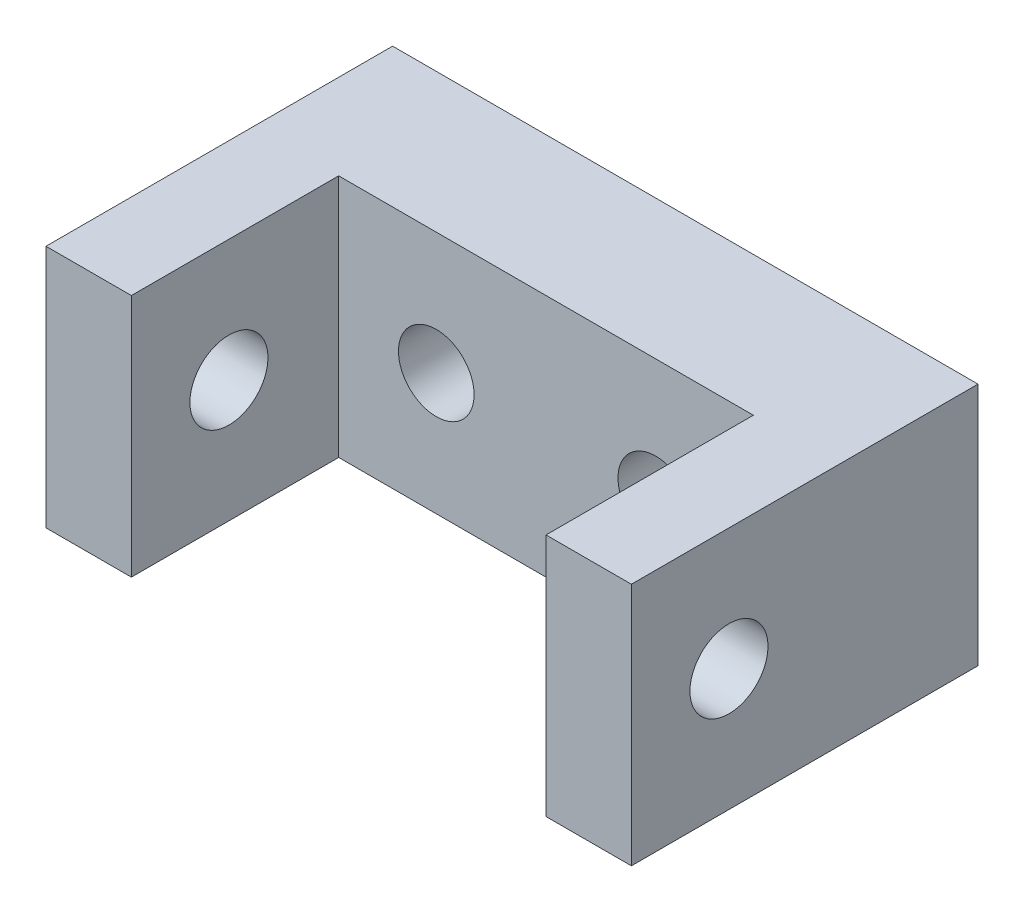
ISO-10303-21;
HEADER;
FILE_DESCRIPTION(('STEP AP214'),'2;1');
FILE_NAME('part.step','',(''),(''),'','','');
FILE_SCHEMA(('AUTOMOTIVE_DESIGN { 1 0 10303 214 1 1 1 1 }'));
ENDSEC;
DATA;
#1=APPLICATION_CONTEXT('core data for automotive mechanical design processes');
#2=APPLICATION_PROTOCOL_DEFINITION('international standard','automotive_design',2000,#1);
#3=PRODUCT_CONTEXT('',#1,'mechanical');
#4=PRODUCT('Part','Part','',(#3));
#5=PRODUCT_RELATED_PRODUCT_CATEGORY('part','',(#4));
#6=PRODUCT_DEFINITION_FORMATION('','',#4);
#7=PRODUCT_DEFINITION_CONTEXT('part definition',#1,'design');
#8=PRODUCT_DEFINITION('design','',#6,#7);
#9=PRODUCT_DEFINITION_SHAPE('','',#8);
#10=(LENGTH_UNIT() NAMED_UNIT(*) SI_UNIT(.MILLI.,.METRE.));
#11=(NAMED_UNIT(*) PLANE_ANGLE_UNIT() SI_UNIT($,.RADIAN.));
#12=(NAMED_UNIT(*) SI_UNIT($,.STERADIAN.) SOLID_ANGLE_UNIT());
#13=UNCERTAINTY_MEASURE_WITH_UNIT(LENGTH_MEASURE(1.E-05),#10,'distance_accuracy_value','');
#14=(GEOMETRIC_REPRESENTATION_CONTEXT(3) GLOBAL_UNCERTAINTY_ASSIGNED_CONTEXT((#13)) GLOBAL_UNIT_ASSIGNED_CONTEXT((#10,
#11,#12)) REPRESENTATION_CONTEXT('',''));
#15=CARTESIAN_POINT('',(0.,0.,0.));
#16=DIRECTION('',(0.,0.,1.));
#17=DIRECTION('',(1.,0.,0.));
#18=AXIS2_PLACEMENT_3D('',#15,#16,#17);
#19=CARTESIAN_POINT('',(0.,0.,14.21));
#20=DIRECTION('',(0.,0.,-1.));
#21=DIRECTION('',(-1.,0.,0.));
#22=AXIS2_PLACEMENT_3D('',#19,#20,#21);
#23=PLANE('',#22);
#24=DIRECTION('',(0.,1.,0.));
#25=VECTOR('',#24,1.);
#26=CARTESIAN_POINT('',(8.5,0.,14.21));
#27=LINE('',#26,#25);
#28=CARTESIAN_POINT('',(8.5,-5.,14.21));
#29=VERTEX_POINT('',#28);
#30=CARTESIAN_POINT('',(8.5,5.,14.21));
#31=VERTEX_POINT('',#30);
#32=EDGE_CURVE('E43',#29,#31,#27,.T.);
#33=ORIENTED_EDGE('',*,*,#32,.F.);
#34=DIRECTION('',(1.,0.,0.));
#35=VECTOR('',#34,1.);
#36=CARTESIAN_POINT('',(-12.,-5.,14.21));
#37=LINE('',#36,#35);
#38=CARTESIAN_POINT('',(12.,-5.,14.21));
#39=VERTEX_POINT('',#38);
#40=EDGE_CURVE('E58',#29,#39,#37,.T.);
#41=ORIENTED_EDGE('',*,*,#40,.T.);
#42=DIRECTION('',(0.,1.,0.));
#43=VECTOR('',#42,1.);
#44=CARTESIAN_POINT('',(12.,-5.,14.21));
#45=LINE('',#44,#43);
#46=CARTESIAN_POINT('',(12.,5.,14.21));
#47=VERTEX_POINT('',#46);
#48=EDGE_CURVE('E142',#39,#47,#45,.T.);
#49=ORIENTED_EDGE('',*,*,#48,.T.);
#50=DIRECTION('',(-1.,0.,0.));
#51=VECTOR('',#50,1.);
#52=CARTESIAN_POINT('',(-12.,5.,14.21));
#53=LINE('',#52,#51);
#54=EDGE_CURVE('E88',#47,#31,#53,.T.);
#55=ORIENTED_EDGE('',*,*,#54,.T.);
#56=EDGE_LOOP('',(#33,#41,#49,#55));
#57=FACE_BOUND('',#56,.T.);
#58=ADVANCED_FACE('F34',(#57),#23,.F.);
#59=CARTESIAN_POINT('',(12.,-5.,14.21));
#60=DIRECTION('',(-1.,0.,0.));
#61=DIRECTION('',(0.,0.,1.));
#62=AXIS2_PLACEMENT_3D('',#59,#60,#61);
#63=PLANE('',#62);
#64=CARTESIAN_POINT('',(12.,0.,10.21));
#65=DIRECTION('',(-1.,0.,0.));
#66=DIRECTION('',(0.,0.,1.));
#67=AXIS2_PLACEMENT_3D('',#64,#65,#66);
#68=CIRCLE('',#67,1.6);
#69=CARTESIAN_POINT('',(12.,0.,11.81));
#70=VERTEX_POINT('',#69);
#71=EDGE_CURVE('E238',#70,#70,#68,.T.);
#72=ORIENTED_EDGE('',*,*,#71,.T.);
#73=EDGE_LOOP('',(#72));
#74=FACE_BOUND('',#73,.T.);
#75=DIRECTION('',(0.,1.,0.));
#76=VECTOR('',#75,1.);
#77=CARTESIAN_POINT('',(12.,-5.,0.));
#78=LINE('',#77,#76);
#79=CARTESIAN_POINT('',(12.,-5.,0.));
#80=VERTEX_POINT('',#79);
#81=CARTESIAN_POINT('',(12.,5.,0.));
#82=VERTEX_POINT('',#81);
#83=EDGE_CURVE('E141',#80,#82,#78,.T.);
#84=ORIENTED_EDGE('',*,*,#83,.T.);
#85=DIRECTION('',(0.,0.,-1.));
#86=VECTOR('',#85,1.);
#87=CARTESIAN_POINT('',(12.,5.,14.21));
#88=LINE('',#87,#86);
#89=EDGE_CURVE('E164',#47,#82,#88,.T.);
#90=ORIENTED_EDGE('',*,*,#89,.F.);
#91=ORIENTED_EDGE('',*,*,#48,.F.);
#92=DIRECTION('',(0.,0.,-1.));
#93=VECTOR('',#92,1.);
#94=CARTESIAN_POINT('',(12.,-5.,14.21));
#95=LINE('',#94,#93);
#96=EDGE_CURVE('E150',#39,#80,#95,.T.);
#97=ORIENTED_EDGE('',*,*,#96,.T.);
#98=EDGE_LOOP('',(#84,#90,#91,#97));
#99=FACE_BOUND('',#98,.T.);
#100=ADVANCED_FACE('F36',(#74,#99),#63,.F.);
#101=CARTESIAN_POINT('',(-12.,5.,14.21));
#102=DIRECTION('',(0.,-1.,0.));
#103=DIRECTION('',(0.,0.,-1.));
#104=AXIS2_PLACEMENT_3D('',#101,#102,#103);
#105=PLANE('',#104);
#106=CARTESIAN_POINT('',(-8.5,5.,14.21));
#107=VERTEX_POINT('',#106);
#108=CARTESIAN_POINT('',(-12.,5.,14.21));
#109=VERTEX_POINT('',#108);
#110=EDGE_CURVE('E144',#107,#109,#53,.T.);
#111=ORIENTED_EDGE('',*,*,#110,.F.);
#112=DIRECTION('',(0.,0.,-1.));
#113=VECTOR('',#112,1.);
#114=CARTESIAN_POINT('',(-8.5,5.,14.21));
#115=LINE('',#114,#113);
#116=CARTESIAN_POINT('',(-8.5,5.,5.71));
#117=VERTEX_POINT('',#116);
#118=EDGE_CURVE('E138',#107,#117,#115,.T.);
#119=ORIENTED_EDGE('',*,*,#118,.T.);
#120=DIRECTION('',(1.,0.,0.));
#121=VECTOR('',#120,1.);
#122=CARTESIAN_POINT('',(-12.,5.,5.71));
#123=LINE('',#122,#121);
#124=CARTESIAN_POINT('',(8.5,5.,5.71));
#125=VERTEX_POINT('',#124);
#126=EDGE_CURVE('E118',#117,#125,#123,.T.);
#127=ORIENTED_EDGE('',*,*,#126,.T.);
#128=DIRECTION('',(0.,0.,-1.));
#129=VECTOR('',#128,1.);
#130=CARTESIAN_POINT('',(8.49999999999999,5.,14.21));
#131=LINE('',#130,#129);
#132=EDGE_CURVE('E135',#31,#125,#131,.T.);
#133=ORIENTED_EDGE('',*,*,#132,.F.);
#134=ORIENTED_EDGE('',*,*,#54,.F.);
#135=ORIENTED_EDGE('',*,*,#89,.T.);
#136=DIRECTION('',(-1.,0.,0.));
#137=VECTOR('',#136,1.);
#138=CARTESIAN_POINT('',(-12.,5.,0.));
#139=LINE('',#138,#137);
#140=CARTESIAN_POINT('',(-12.,5.,0.));
#141=VERTEX_POINT('',#140);
#142=EDGE_CURVE('E153',#82,#141,#139,.T.);
#143=ORIENTED_EDGE('',*,*,#142,.T.);
#144=DIRECTION('',(0.,0.,-1.));
#145=VECTOR('',#144,1.);
#146=CARTESIAN_POINT('',(-12.,5.,14.21));
#147=LINE('',#146,#145);
#148=EDGE_CURVE('E161',#109,#141,#147,.T.);
#149=ORIENTED_EDGE('',*,*,#148,.F.);
#150=EDGE_LOOP('',(#111,#119,#127,#133,#134,#135,#143,#149));
#151=FACE_BOUND('',#150,.T.);
#152=ADVANCED_FACE('F168',(#151),#105,.F.);
#153=CARTESIAN_POINT('',(-12.,-5.,14.21));
#154=DIRECTION('',(1.,0.,0.));
#155=DIRECTION('',(0.,0.,-1.));
#156=AXIS2_PLACEMENT_3D('',#153,#154,#155);
#157=PLANE('',#156);
#158=CARTESIAN_POINT('',(-12.,0.,10.21));
#159=DIRECTION('',(-1.,0.,0.));
#160=DIRECTION('',(0.,0.,1.));
#161=AXIS2_PLACEMENT_3D('',#158,#159,#160);
#162=CIRCLE('',#161,1.6);
#163=CARTESIAN_POINT('',(-12.,0.,11.81));
#164=VERTEX_POINT('',#163);
#165=EDGE_CURVE('E237',#164,#164,#162,.T.);
#166=ORIENTED_EDGE('',*,*,#165,.F.);
#167=EDGE_LOOP('',(#166));
#168=FACE_BOUND('',#167,.T.);
#169=DIRECTION('',(0.,-1.,0.));
#170=VECTOR('',#169,1.);
#171=CARTESIAN_POINT('',(-12.,-5.,0.));
#172=LINE('',#171,#170);
#173=CARTESIAN_POINT('',(-12.,-5.,0.));
#174=VERTEX_POINT('',#173);
#175=EDGE_CURVE('E155',#141,#174,#172,.T.);
#176=ORIENTED_EDGE('',*,*,#175,.T.);
#177=DIRECTION('',(0.,0.,-1.));
#178=VECTOR('',#177,1.);
#179=CARTESIAN_POINT('',(-12.,-5.,14.21));
#180=LINE('',#179,#178);
#181=CARTESIAN_POINT('',(-12.,-5.,14.21));
#182=VERTEX_POINT('',#181);
#183=EDGE_CURVE('E159',#182,#174,#180,.T.);
#184=ORIENTED_EDGE('',*,*,#183,.F.);
#185=DIRECTION('',(0.,-1.,0.));
#186=VECTOR('',#185,1.);
#187=CARTESIAN_POINT('',(-12.,-5.,14.21));
#188=LINE('',#187,#186);
#189=EDGE_CURVE('E146',#109,#182,#188,.T.);
#190=ORIENTED_EDGE('',*,*,#189,.F.);
#191=ORIENTED_EDGE('',*,*,#148,.T.);
#192=EDGE_LOOP('',(#176,#184,#190,#191));
#193=FACE_BOUND('',#192,.T.);
#194=ADVANCED_FACE('F178',(#168,#193),#157,.F.);
#195=CARTESIAN_POINT('',(-12.,-5.,14.21));
#196=DIRECTION('',(0.,1.,0.));
#197=DIRECTION('',(0.,0.,1.));
#198=AXIS2_PLACEMENT_3D('',#195,#196,#197);
#199=PLANE('',#198);
#200=DIRECTION('',(1.,0.,0.));
#201=VECTOR('',#200,1.);
#202=CARTESIAN_POINT('',(0.,-5.,5.71));
#203=LINE('',#202,#201);
#204=CARTESIAN_POINT('',(-8.5,-5.,5.71));
#205=VERTEX_POINT('',#204);
#206=CARTESIAN_POINT('',(8.5,-5.,5.71));
#207=VERTEX_POINT('',#206);
#208=EDGE_CURVE('E116',#205,#207,#203,.T.);
#209=ORIENTED_EDGE('',*,*,#208,.F.);
#210=DIRECTION('',(0.,0.,-1.));
#211=VECTOR('',#210,1.);
#212=CARTESIAN_POINT('',(-8.5,-5.,0.));
#213=LINE('',#212,#211);
#214=CARTESIAN_POINT('',(-8.5,-5.,14.21));
#215=VERTEX_POINT('',#214);
#216=EDGE_CURVE('E124',#215,#205,#213,.T.);
#217=ORIENTED_EDGE('',*,*,#216,.F.);
#218=EDGE_CURVE('E148',#182,#215,#37,.T.);
#219=ORIENTED_EDGE('',*,*,#218,.F.);
#220=ORIENTED_EDGE('',*,*,#183,.T.);
#221=DIRECTION('',(1.,0.,0.));
#222=VECTOR('',#221,1.);
#223=CARTESIAN_POINT('',(-12.,-5.,0.));
#224=LINE('',#223,#222);
#225=EDGE_CURVE('E80',#174,#80,#224,.T.);
#226=ORIENTED_EDGE('',*,*,#225,.T.);
#227=ORIENTED_EDGE('',*,*,#96,.F.);
#228=ORIENTED_EDGE('',*,*,#40,.F.);
#229=DIRECTION('',(0.,0.,-1.));
#230=VECTOR('',#229,1.);
#231=CARTESIAN_POINT('',(8.5,-5.,0.));
#232=LINE('',#231,#230);
#233=EDGE_CURVE('E50',#29,#207,#232,.T.);
#234=ORIENTED_EDGE('',*,*,#233,.T.);
#235=EDGE_LOOP('',(#209,#217,#219,#220,#226,#227,#228,#234));
#236=FACE_BOUND('',#235,.T.);
#237=ADVANCED_FACE('F130',(#236),#199,.F.);
#238=ORIENTED_EDGE('',*,*,#218,.T.);
#239=DIRECTION('',(0.,1.,0.));
#240=VECTOR('',#239,1.);
#241=CARTESIAN_POINT('',(-8.5,0.,14.21));
#242=LINE('',#241,#240);
#243=EDGE_CURVE('E11',#215,#107,#242,.T.);
#244=ORIENTED_EDGE('',*,*,#243,.T.);
#245=ORIENTED_EDGE('',*,*,#110,.T.);
#246=ORIENTED_EDGE('',*,*,#189,.T.);
#247=EDGE_LOOP('',(#238,#244,#245,#246));
#248=FACE_BOUND('',#247,.T.);
#249=ADVANCED_FACE('F182',(#248),#23,.F.);
#250=CARTESIAN_POINT('',(0.,0.,0.));
#251=DIRECTION('',(0.,0.,-1.));
#252=DIRECTION('',(-1.,0.,0.));
#253=AXIS2_PLACEMENT_3D('',#250,#251,#252);
#254=PLANE('',#253);
#255=CARTESIAN_POINT('',(-4.5,0.,0.));
#256=DIRECTION('',(0.,0.,-1.));
#257=DIRECTION('',(-1.,0.,0.));
#258=AXIS2_PLACEMENT_3D('',#255,#256,#257);
#259=CIRCLE('',#258,1.55);
#260=CARTESIAN_POINT('',(-6.05,0.,0.));
#261=VERTEX_POINT('',#260);
#262=EDGE_CURVE('E224',#261,#261,#259,.T.);
#263=ORIENTED_EDGE('',*,*,#262,.F.);
#264=EDGE_LOOP('',(#263));
#265=FACE_BOUND('',#264,.T.);
#266=CARTESIAN_POINT('',(4.5,0.,0.));
#267=DIRECTION('',(0.,0.,-1.));
#268=DIRECTION('',(-1.,0.,0.));
#269=AXIS2_PLACEMENT_3D('',#266,#267,#268);
#270=CIRCLE('',#269,1.55);
#271=CARTESIAN_POINT('',(2.95,0.,0.));
#272=VERTEX_POINT('',#271);
#273=EDGE_CURVE('E228',#272,#272,#270,.T.);
#274=ORIENTED_EDGE('',*,*,#273,.F.);
#275=EDGE_LOOP('',(#274));
#276=FACE_BOUND('',#275,.T.);
#277=ORIENTED_EDGE('',*,*,#83,.F.);
#278=ORIENTED_EDGE('',*,*,#225,.F.);
#279=ORIENTED_EDGE('',*,*,#175,.F.);
#280=ORIENTED_EDGE('',*,*,#142,.F.);
#281=EDGE_LOOP('',(#277,#278,#279,#280));
#282=FACE_BOUND('',#281,.T.);
#283=ADVANCED_FACE('F180',(#265,#276,#282),#254,.T.);
#284=CARTESIAN_POINT('',(0.,7.,5.71));
#285=DIRECTION('',(0.,0.,-1.));
#286=DIRECTION('',(-1.,0.,0.));
#287=AXIS2_PLACEMENT_3D('',#284,#285,#286);
#288=PLANE('',#287);
#289=CARTESIAN_POINT('',(-4.5,0.,5.71));
#290=DIRECTION('',(0.,0.,1.));
#291=DIRECTION('',(1.,0.,0.));
#292=AXIS2_PLACEMENT_3D('',#289,#290,#291);
#293=CIRCLE('',#292,1.55);
#294=CARTESIAN_POINT('',(-2.95,0.,5.71));
#295=VERTEX_POINT('',#294);
#296=EDGE_CURVE('E227',#295,#295,#293,.T.);
#297=ORIENTED_EDGE('',*,*,#296,.F.);
#298=EDGE_LOOP('',(#297));
#299=FACE_BOUND('',#298,.T.);
#300=CARTESIAN_POINT('',(4.5,0.,5.71));
#301=DIRECTION('',(0.,0.,1.));
#302=DIRECTION('',(1.,0.,0.));
#303=AXIS2_PLACEMENT_3D('',#300,#301,#302);
#304=CIRCLE('',#303,1.55);
#305=CARTESIAN_POINT('',(6.05,0.,5.71));
#306=VERTEX_POINT('',#305);
#307=EDGE_CURVE('E229',#306,#306,#304,.T.);
#308=ORIENTED_EDGE('',*,*,#307,.F.);
#309=EDGE_LOOP('',(#308));
#310=FACE_BOUND('',#309,.T.);
#311=DIRECTION('',(0.,-1.,0.));
#312=VECTOR('',#311,1.);
#313=CARTESIAN_POINT('',(-8.5,7.,5.71));
#314=LINE('',#313,#312);
#315=EDGE_CURVE('E111',#117,#205,#314,.T.);
#316=ORIENTED_EDGE('',*,*,#315,.T.);
#317=ORIENTED_EDGE('',*,*,#208,.T.);
#318=DIRECTION('',(0.,-1.,0.));
#319=VECTOR('',#318,1.);
#320=CARTESIAN_POINT('',(8.5,7.,5.71));
#321=LINE('',#320,#319);
#322=EDGE_CURVE('E121',#125,#207,#321,.T.);
#323=ORIENTED_EDGE('',*,*,#322,.F.);
#324=ORIENTED_EDGE('',*,*,#126,.F.);
#325=EDGE_LOOP('',(#316,#317,#323,#324));
#326=FACE_BOUND('',#325,.T.);
#327=ADVANCED_FACE('F113',(#299,#310,#326),#288,.F.);
#328=CARTESIAN_POINT('',(-8.5,7.,0.));
#329=DIRECTION('',(-1.,0.,0.));
#330=DIRECTION('',(0.,0.,1.));
#331=AXIS2_PLACEMENT_3D('',#328,#329,#330);
#332=PLANE('',#331);
#333=CARTESIAN_POINT('',(-8.5,0.,10.21));
#334=DIRECTION('',(-1.,0.,0.));
#335=DIRECTION('',(0.,0.,1.));
#336=AXIS2_PLACEMENT_3D('',#333,#334,#335);
#337=CIRCLE('',#336,1.6);
#338=CARTESIAN_POINT('',(-8.5,0.,11.81));
#339=VERTEX_POINT('',#338);
#340=EDGE_CURVE('E128',#339,#339,#337,.T.);
#341=ORIENTED_EDGE('',*,*,#340,.T.);
#342=EDGE_LOOP('',(#341));
#343=FACE_BOUND('',#342,.T.);
#344=ORIENTED_EDGE('',*,*,#243,.F.);
#345=ORIENTED_EDGE('',*,*,#216,.T.);
#346=ORIENTED_EDGE('',*,*,#315,.F.);
#347=ORIENTED_EDGE('',*,*,#118,.F.);
#348=EDGE_LOOP('',(#344,#345,#346,#347));
#349=FACE_BOUND('',#348,.T.);
#350=ADVANCED_FACE('F125',(#343,#349),#332,.F.);
#351=CARTESIAN_POINT('',(8.5,7.,0.));
#352=DIRECTION('',(-1.,0.,0.));
#353=DIRECTION('',(0.,0.,1.));
#354=AXIS2_PLACEMENT_3D('',#351,#352,#353);
#355=PLANE('',#354);
#356=CARTESIAN_POINT('',(8.5,0.,10.21));
#357=DIRECTION('',(-1.,0.,0.));
#358=DIRECTION('',(0.,0.,1.));
#359=AXIS2_PLACEMENT_3D('',#356,#357,#358);
#360=CIRCLE('',#359,1.6);
#361=CARTESIAN_POINT('',(8.5,0.,11.81));
#362=VERTEX_POINT('',#361);
#363=EDGE_CURVE('E38',#362,#362,#360,.T.);
#364=ORIENTED_EDGE('',*,*,#363,.F.);
#365=EDGE_LOOP('',(#364));
#366=FACE_BOUND('',#365,.T.);
#367=ORIENTED_EDGE('',*,*,#132,.T.);
#368=ORIENTED_EDGE('',*,*,#322,.T.);
#369=ORIENTED_EDGE('',*,*,#233,.F.);
#370=ORIENTED_EDGE('',*,*,#32,.T.);
#371=EDGE_LOOP('',(#367,#368,#369,#370));
#372=FACE_BOUND('',#371,.T.);
#373=ADVANCED_FACE('F166',(#366,#372),#355,.T.);
#374=CARTESIAN_POINT('',(12.,0.,10.21));
#375=DIRECTION('',(-1.,0.,0.));
#376=DIRECTION('',(0.,0.,1.));
#377=AXIS2_PLACEMENT_3D('',#374,#375,#376);
#378=CYLINDRICAL_SURFACE('',#377,1.6);
#379=ORIENTED_EDGE('',*,*,#363,.T.);
#380=EDGE_LOOP('',(#379));
#381=FACE_BOUND('',#380,.T.);
#382=ORIENTED_EDGE('',*,*,#71,.F.);
#383=EDGE_LOOP('',(#382));
#384=FACE_BOUND('',#383,.T.);
#385=ADVANCED_FACE('F207',(#381,#384),#378,.F.);
#386=ORIENTED_EDGE('',*,*,#165,.T.);
#387=EDGE_LOOP('',(#386));
#388=FACE_BOUND('',#387,.T.);
#389=ORIENTED_EDGE('',*,*,#340,.F.);
#390=EDGE_LOOP('',(#389));
#391=FACE_BOUND('',#390,.T.);
#392=ADVANCED_FACE('F211',(#388,#391),#378,.F.);
#393=CARTESIAN_POINT('',(4.5,0.,-6.29));
#394=DIRECTION('',(0.,0.,1.));
#395=DIRECTION('',(1.,0.,0.));
#396=AXIS2_PLACEMENT_3D('',#393,#394,#395);
#397=CYLINDRICAL_SURFACE('',#396,1.55);
#398=ORIENTED_EDGE('',*,*,#273,.T.);
#399=EDGE_LOOP('',(#398));
#400=FACE_BOUND('',#399,.T.);
#401=ORIENTED_EDGE('',*,*,#307,.T.);
#402=EDGE_LOOP('',(#401));
#403=FACE_BOUND('',#402,.T.);
#404=ADVANCED_FACE('F213',(#400,#403),#397,.F.);
#405=CARTESIAN_POINT('',(-4.5,0.,-6.29));
#406=DIRECTION('',(0.,0.,1.));
#407=DIRECTION('',(1.,0.,0.));
#408=AXIS2_PLACEMENT_3D('',#405,#406,#407);
#409=CYLINDRICAL_SURFACE('',#408,1.55);
#410=ORIENTED_EDGE('',*,*,#262,.T.);
#411=EDGE_LOOP('',(#410));
#412=FACE_BOUND('',#411,.T.);
#413=ORIENTED_EDGE('',*,*,#296,.T.);
#414=EDGE_LOOP('',(#413));
#415=FACE_BOUND('',#414,.T.);
#416=ADVANCED_FACE('F216',(#412,#415),#409,.F.);
#417=CLOSED_SHELL('',(#58,#100,#152,#194,#237,#249,#283,#327,#350,#373,#385,#392,#404,#416));
#418=MANIFOLD_SOLID_BREP('B2',#417);
#419=ADVANCED_BREP_SHAPE_REPRESENTATION('',(#18,#418),#14);
#420=SHAPE_DEFINITION_REPRESENTATION(#9,#419);
ENDSEC;
END-ISO-10303-21;
